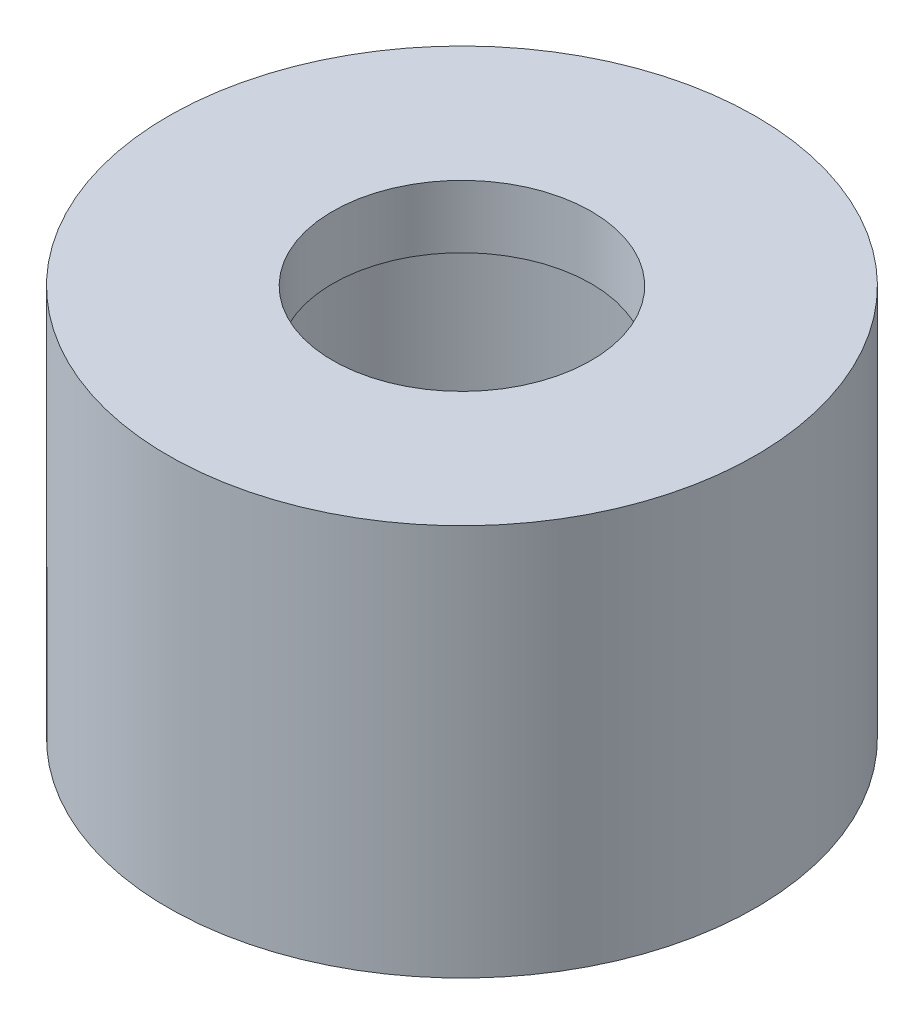
ISO-10303-21;
HEADER;
FILE_DESCRIPTION(('STEP AP214'),'2;1');
FILE_NAME('part.step','',(''),(''),'','','');
FILE_SCHEMA(('AUTOMOTIVE_DESIGN { 1 0 10303 214 1 1 1 1 }'));
ENDSEC;
DATA;
#1=APPLICATION_CONTEXT('core data for automotive mechanical design processes');
#2=APPLICATION_PROTOCOL_DEFINITION('international standard','automotive_design',2000,#1);
#3=PRODUCT_CONTEXT('',#1,'mechanical');
#4=PRODUCT('Part','Part','',(#3));
#5=PRODUCT_RELATED_PRODUCT_CATEGORY('part','',(#4));
#6=PRODUCT_DEFINITION_FORMATION('','',#4);
#7=PRODUCT_DEFINITION_CONTEXT('part definition',#1,'design');
#8=PRODUCT_DEFINITION('design','',#6,#7);
#9=PRODUCT_DEFINITION_SHAPE('','',#8);
#10=(LENGTH_UNIT() NAMED_UNIT(*) SI_UNIT(.MILLI.,.METRE.));
#11=(NAMED_UNIT(*) PLANE_ANGLE_UNIT() SI_UNIT($,.RADIAN.));
#12=(NAMED_UNIT(*) SI_UNIT($,.STERADIAN.) SOLID_ANGLE_UNIT());
#13=UNCERTAINTY_MEASURE_WITH_UNIT(LENGTH_MEASURE(1.E-05),#10,'distance_accuracy_value','');
#14=(GEOMETRIC_REPRESENTATION_CONTEXT(3) GLOBAL_UNCERTAINTY_ASSIGNED_CONTEXT((#13)) GLOBAL_UNIT_ASSIGNED_CONTEXT((#10,
#11,#12)) REPRESENTATION_CONTEXT('',''));
#15=CARTESIAN_POINT('',(0.,0.,0.));
#16=DIRECTION('',(0.,0.,1.));
#17=DIRECTION('',(1.,0.,0.));
#18=AXIS2_PLACEMENT_3D('',#15,#16,#17);
#19=CARTESIAN_POINT('',(0.,0.,0.));
#20=DIRECTION('',(0.,-1.,0.));
#21=DIRECTION('',(0.,0.,-1.));
#22=AXIS2_PLACEMENT_3D('',#19,#20,#21);
#23=CYLINDRICAL_SURFACE('',#22,7.5);
#24=CARTESIAN_POINT('',(0.,2.65843777522438,0.));
#25=DIRECTION('',(0.,-1.,0.));
#26=DIRECTION('',(0.,0.,-1.));
#27=AXIS2_PLACEMENT_3D('',#24,#25,#26);
#28=CIRCLE('',#27,7.5);
#29=CARTESIAN_POINT('',(0.,2.65843777522438,-7.5));
#30=VERTEX_POINT('',#29);
#31=EDGE_CURVE('E10',#30,#30,#28,.T.);
#32=ORIENTED_EDGE('',*,*,#31,.F.);
#33=EDGE_LOOP('',(#32));
#34=FACE_BOUND('',#33,.T.);
#35=CARTESIAN_POINT('',(0.,12.6584377752244,0.));
#36=DIRECTION('',(0.,-1.,0.));
#37=DIRECTION('',(0.,0.,-1.));
#38=AXIS2_PLACEMENT_3D('',#35,#36,#37);
#39=CIRCLE('',#38,7.5);
#40=CARTESIAN_POINT('',(0.,12.6584377752244,-7.5));
#41=VERTEX_POINT('',#40);
#42=EDGE_CURVE('E55',#41,#41,#39,.T.);
#43=ORIENTED_EDGE('',*,*,#42,.T.);
#44=EDGE_LOOP('',(#43));
#45=FACE_BOUND('',#44,.T.);
#46=ADVANCED_FACE('F33',(#34,#45),#23,.T.);
#47=CARTESIAN_POINT('',(0.,2.65843777522438,0.));
#48=DIRECTION('',(0.,1.,0.));
#49=DIRECTION('',(0.,0.,1.));
#50=AXIS2_PLACEMENT_3D('',#47,#48,#49);
#51=PLANE('',#50);
#52=CARTESIAN_POINT('',(0.,2.65843777522438,0.));
#53=DIRECTION('',(0.,-1.,0.));
#54=DIRECTION('',(0.,0.,-1.));
#55=AXIS2_PLACEMENT_3D('',#52,#53,#54);
#56=CIRCLE('',#55,5.5);
#57=CARTESIAN_POINT('',(0.,2.65843777522438,-5.5));
#58=VERTEX_POINT('',#57);
#59=EDGE_CURVE('E39',#58,#58,#56,.T.);
#60=ORIENTED_EDGE('',*,*,#59,.F.);
#61=EDGE_LOOP('',(#60));
#62=FACE_BOUND('',#61,.T.);
#63=ORIENTED_EDGE('',*,*,#31,.T.);
#64=EDGE_LOOP('',(#63));
#65=FACE_BOUND('',#64,.T.);
#66=ADVANCED_FACE('F72',(#62,#65),#51,.F.);
#67=CARTESIAN_POINT('',(0.,0.,0.));
#68=DIRECTION('',(0.,-1.,0.));
#69=DIRECTION('',(0.,0.,-1.));
#70=AXIS2_PLACEMENT_3D('',#67,#68,#69);
#71=CYLINDRICAL_SURFACE('',#70,5.5);
#72=CARTESIAN_POINT('',(0.,11.0584377752244,0.));
#73=DIRECTION('',(0.,-1.,0.));
#74=DIRECTION('',(0.,0.,-1.));
#75=AXIS2_PLACEMENT_3D('',#72,#73,#74);
#76=CIRCLE('',#75,5.5);
#77=CARTESIAN_POINT('',(0.,11.0584377752244,-5.5));
#78=VERTEX_POINT('',#77);
#79=EDGE_CURVE('E43',#78,#78,#76,.T.);
#80=ORIENTED_EDGE('',*,*,#79,.F.);
#81=EDGE_LOOP('',(#80));
#82=FACE_BOUND('',#81,.T.);
#83=ORIENTED_EDGE('',*,*,#59,.T.);
#84=EDGE_LOOP('',(#83));
#85=FACE_BOUND('',#84,.T.);
#86=ADVANCED_FACE('F77',(#82,#85),#71,.F.);
#87=CARTESIAN_POINT('',(0.,11.0584377752244,0.));
#88=DIRECTION('',(0.,1.,0.));
#89=DIRECTION('',(0.,0.,1.));
#90=AXIS2_PLACEMENT_3D('',#87,#88,#89);
#91=PLANE('',#90);
#92=CARTESIAN_POINT('',(0.,11.0584377752244,0.));
#93=DIRECTION('',(0.,-1.,0.));
#94=DIRECTION('',(0.,0.,-1.));
#95=AXIS2_PLACEMENT_3D('',#92,#93,#94);
#96=CIRCLE('',#95,3.3);
#97=CARTESIAN_POINT('',(0.,11.0584377752244,-3.3));
#98=VERTEX_POINT('',#97);
#99=EDGE_CURVE('E47',#98,#98,#96,.T.);
#100=ORIENTED_EDGE('',*,*,#99,.F.);
#101=EDGE_LOOP('',(#100));
#102=FACE_BOUND('',#101,.T.);
#103=ORIENTED_EDGE('',*,*,#79,.T.);
#104=EDGE_LOOP('',(#103));
#105=FACE_BOUND('',#104,.T.);
#106=ADVANCED_FACE('F68',(#102,#105),#91,.F.);
#107=CARTESIAN_POINT('',(0.,0.,0.));
#108=DIRECTION('',(0.,-1.,0.));
#109=DIRECTION('',(0.,0.,-1.));
#110=AXIS2_PLACEMENT_3D('',#107,#108,#109);
#111=CYLINDRICAL_SURFACE('',#110,3.3);
#112=ORIENTED_EDGE('',*,*,#99,.T.);
#113=EDGE_LOOP('',(#112));
#114=FACE_BOUND('',#113,.T.);
#115=CARTESIAN_POINT('',(0.,12.6584377752244,0.));
#116=DIRECTION('',(0.,-1.,0.));
#117=DIRECTION('',(0.,0.,-1.));
#118=AXIS2_PLACEMENT_3D('',#115,#116,#117);
#119=CIRCLE('',#118,3.3);
#120=CARTESIAN_POINT('',(0.,12.6584377752244,-3.3));
#121=VERTEX_POINT('',#120);
#122=EDGE_CURVE('E52',#121,#121,#119,.T.);
#123=ORIENTED_EDGE('',*,*,#122,.F.);
#124=EDGE_LOOP('',(#123));
#125=FACE_BOUND('',#124,.T.);
#126=ADVANCED_FACE('F62',(#114,#125),#111,.F.);
#127=CARTESIAN_POINT('',(0.,12.6584377752244,0.));
#128=DIRECTION('',(0.,1.,0.));
#129=DIRECTION('',(0.,0.,1.));
#130=AXIS2_PLACEMENT_3D('',#127,#128,#129);
#131=PLANE('',#130);
#132=ORIENTED_EDGE('',*,*,#122,.T.);
#133=EDGE_LOOP('',(#132));
#134=FACE_BOUND('',#133,.T.);
#135=ORIENTED_EDGE('',*,*,#42,.F.);
#136=EDGE_LOOP('',(#135));
#137=FACE_BOUND('',#136,.T.);
#138=ADVANCED_FACE('F60',(#134,#137),#131,.T.);
#139=CLOSED_SHELL('',(#46,#66,#86,#106,#126,#138));
#140=MANIFOLD_SOLID_BREP('B2',#139);
#141=ADVANCED_BREP_SHAPE_REPRESENTATION('',(#18,#140),#14);
#142=SHAPE_DEFINITION_REPRESENTATION(#9,#141);
ENDSEC;
END-ISO-10303-21;
